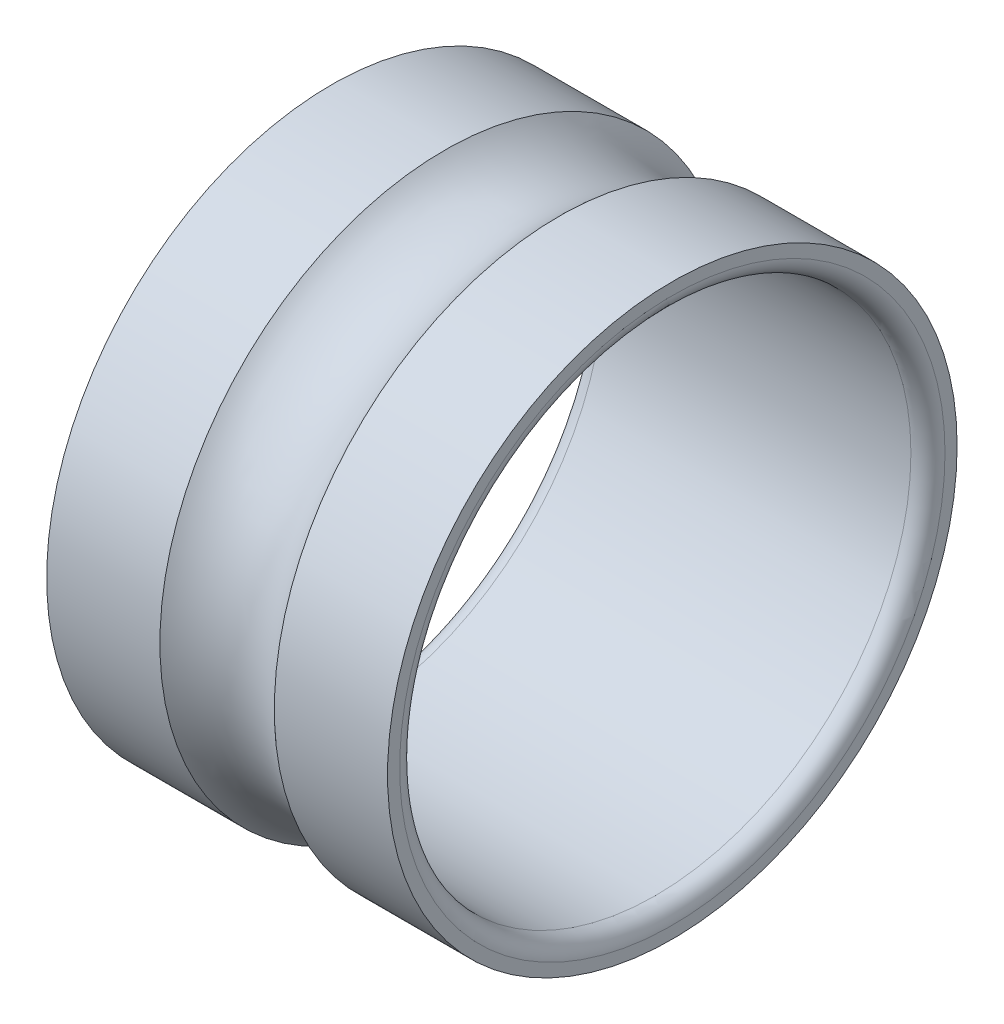
ISO-10303-21;
HEADER;
FILE_DESCRIPTION(('STEP AP214'),'2;1');
FILE_NAME('part.step','',(''),(''),'','','');
FILE_SCHEMA(('AUTOMOTIVE_DESIGN { 1 0 10303 214 1 1 1 1 }'));
ENDSEC;
DATA;
#1=APPLICATION_CONTEXT('core data for automotive mechanical design processes');
#2=APPLICATION_PROTOCOL_DEFINITION('international standard','automotive_design',2000,#1);
#3=PRODUCT_CONTEXT('',#1,'mechanical');
#4=PRODUCT('Part','Part','',(#3));
#5=PRODUCT_RELATED_PRODUCT_CATEGORY('part','',(#4));
#6=PRODUCT_DEFINITION_FORMATION('','',#4);
#7=PRODUCT_DEFINITION_CONTEXT('part definition',#1,'design');
#8=PRODUCT_DEFINITION('design','',#6,#7);
#9=PRODUCT_DEFINITION_SHAPE('','',#8);
#10=(LENGTH_UNIT() NAMED_UNIT(*) SI_UNIT(.MILLI.,.METRE.));
#11=(NAMED_UNIT(*) PLANE_ANGLE_UNIT() SI_UNIT($,.RADIAN.));
#12=(NAMED_UNIT(*) SI_UNIT($,.STERADIAN.) SOLID_ANGLE_UNIT());
#13=UNCERTAINTY_MEASURE_WITH_UNIT(LENGTH_MEASURE(1.E-05),#10,'distance_accuracy_value','');
#14=(GEOMETRIC_REPRESENTATION_CONTEXT(3) GLOBAL_UNCERTAINTY_ASSIGNED_CONTEXT((#13)) GLOBAL_UNIT_ASSIGNED_CONTEXT((#10,
#11,#12)) REPRESENTATION_CONTEXT('',''));
#15=CARTESIAN_POINT('',(0.,0.,0.));
#16=DIRECTION('',(0.,0.,1.));
#17=DIRECTION('',(1.,0.,0.));
#18=AXIS2_PLACEMENT_3D('',#15,#16,#17);
#19=CARTESIAN_POINT('',(-1.42875,0.,0.));
#20=DIRECTION('',(1.,0.,0.));
#21=DIRECTION('',(0.,0.,-1.));
#22=AXIS2_PLACEMENT_3D('',#19,#20,#21);
#23=TOROIDAL_SURFACE('',#22,2.54,0.15875);
#24=CARTESIAN_POINT('',(-1.42875,0.,0.));
#25=DIRECTION('',(1.,0.,0.));
#26=DIRECTION('',(0.,0.,-1.));
#27=AXIS2_PLACEMENT_3D('',#24,#25,#26);
#28=CIRCLE('',#27,2.38125);
#29=CARTESIAN_POINT('',(-1.42875,0.,-2.38125));
#30=VERTEX_POINT('',#29);
#31=EDGE_CURVE('E10',#30,#30,#28,.T.);
#32=ORIENTED_EDGE('',*,*,#31,.T.);
#33=EDGE_LOOP('',(#32));
#34=FACE_BOUND('',#33,.T.);
#35=CARTESIAN_POINT('',(-1.5875,0.,0.));
#36=DIRECTION('',(1.,0.,0.));
#37=DIRECTION('',(0.,0.,-1.));
#38=AXIS2_PLACEMENT_3D('',#35,#36,#37);
#39=CIRCLE('',#38,2.54);
#40=CARTESIAN_POINT('',(-1.5875,0.,-2.54));
#41=VERTEX_POINT('',#40);
#42=EDGE_CURVE('E58',#41,#41,#39,.T.);
#43=ORIENTED_EDGE('',*,*,#42,.F.);
#44=EDGE_LOOP('',(#43));
#45=FACE_BOUND('',#44,.T.);
#46=ADVANCED_FACE('F30',(#34,#45),#23,.T.);
#47=CARTESIAN_POINT('',(-1.5875,0.,0.));
#48=DIRECTION('',(1.,0.,0.));
#49=DIRECTION('',(0.,0.,-1.));
#50=AXIS2_PLACEMENT_3D('',#47,#48,#49);
#51=CYLINDRICAL_SURFACE('',#50,2.38125);
#52=CARTESIAN_POINT('',(1.42875,0.,0.));
#53=DIRECTION('',(1.,0.,0.));
#54=DIRECTION('',(0.,0.,-1.));
#55=AXIS2_PLACEMENT_3D('',#52,#53,#54);
#56=CIRCLE('',#55,2.38125);
#57=CARTESIAN_POINT('',(1.42875,0.,-2.38125));
#58=VERTEX_POINT('',#57);
#59=EDGE_CURVE('E36',#58,#58,#56,.T.);
#60=ORIENTED_EDGE('',*,*,#59,.T.);
#61=EDGE_LOOP('',(#60));
#62=FACE_BOUND('',#61,.T.);
#63=ORIENTED_EDGE('',*,*,#31,.F.);
#64=EDGE_LOOP('',(#63));
#65=FACE_BOUND('',#64,.T.);
#66=ADVANCED_FACE('F66',(#62,#65),#51,.F.);
#67=CARTESIAN_POINT('',(1.42875,0.,0.));
#68=DIRECTION('',(1.,0.,0.));
#69=DIRECTION('',(0.,0.,-1.));
#70=AXIS2_PLACEMENT_3D('',#67,#68,#69);
#71=TOROIDAL_SURFACE('',#70,2.54,0.15875);
#72=CARTESIAN_POINT('',(1.5875,0.,0.));
#73=DIRECTION('',(1.,0.,0.));
#74=DIRECTION('',(0.,0.,-1.));
#75=AXIS2_PLACEMENT_3D('',#72,#73,#74);
#76=CIRCLE('',#75,2.54);
#77=CARTESIAN_POINT('',(1.5875,0.,-2.54));
#78=VERTEX_POINT('',#77);
#79=EDGE_CURVE('E40',#78,#78,#76,.T.);
#80=ORIENTED_EDGE('',*,*,#79,.T.);
#81=EDGE_LOOP('',(#80));
#82=FACE_BOUND('',#81,.T.);
#83=ORIENTED_EDGE('',*,*,#59,.F.);
#84=EDGE_LOOP('',(#83));
#85=FACE_BOUND('',#84,.T.);
#86=ADVANCED_FACE('F70',(#82,#85),#71,.T.);
#87=CARTESIAN_POINT('',(1.5875,2.54,0.));
#88=DIRECTION('',(1.,0.,0.));
#89=DIRECTION('',(0.,0.,-1.));
#90=AXIS2_PLACEMENT_3D('',#87,#88,#89);
#91=PLANE('',#90);
#92=CARTESIAN_POINT('',(1.5875,0.,0.));
#93=DIRECTION('',(1.,0.,0.));
#94=DIRECTION('',(0.,0.,-1.));
#95=AXIS2_PLACEMENT_3D('',#92,#93,#94);
#96=CIRCLE('',#95,2.6527125);
#97=CARTESIAN_POINT('',(1.5875,0.,-2.6527125));
#98=VERTEX_POINT('',#97);
#99=EDGE_CURVE('E44',#98,#98,#96,.T.);
#100=ORIENTED_EDGE('',*,*,#99,.T.);
#101=EDGE_LOOP('',(#100));
#102=FACE_BOUND('',#101,.T.);
#103=ORIENTED_EDGE('',*,*,#79,.F.);
#104=EDGE_LOOP('',(#103));
#105=FACE_BOUND('',#104,.T.);
#106=ADVANCED_FACE('F74',(#102,#105),#91,.T.);
#107=CARTESIAN_POINT('',(-1.5875,0.,0.));
#108=DIRECTION('',(1.,0.,0.));
#109=DIRECTION('',(0.,0.,-1.));
#110=AXIS2_PLACEMENT_3D('',#107,#108,#109);
#111=CYLINDRICAL_SURFACE('',#110,2.6527125);
#112=CARTESIAN_POINT('',(0.532839828624654,0.,0.));
#113=DIRECTION('',(1.,0.,0.));
#114=DIRECTION('',(0.,0.,-1.));
#115=AXIS2_PLACEMENT_3D('',#112,#113,#114);
#116=CIRCLE('',#115,2.6527125);
#117=CARTESIAN_POINT('',(0.532839828624654,0.,-2.6527125));
#118=VERTEX_POINT('',#117);
#119=EDGE_CURVE('E49',#118,#118,#116,.T.);
#120=ORIENTED_EDGE('',*,*,#119,.T.);
#121=EDGE_LOOP('',(#120));
#122=FACE_BOUND('',#121,.T.);
#123=ORIENTED_EDGE('',*,*,#99,.F.);
#124=EDGE_LOOP('',(#123));
#125=FACE_BOUND('',#124,.T.);
#126=ADVANCED_FACE('F81',(#122,#125),#111,.T.);
#127=CARTESIAN_POINT('',(0.,0.,0.));
#128=DIRECTION('',(1.,0.,0.));
#129=DIRECTION('',(0.,0.,-1.));
#130=AXIS2_PLACEMENT_3D('',#127,#128,#129);
#131=TOROIDAL_SURFACE('',#130,3.175,0.746125);
#132=CARTESIAN_POINT('',(-0.532839828624653,0.,0.));
#133=DIRECTION('',(1.,0.,0.));
#134=DIRECTION('',(0.,0.,-1.));
#135=AXIS2_PLACEMENT_3D('',#132,#133,#134);
#136=CIRCLE('',#135,2.6527125);
#137=CARTESIAN_POINT('',(-0.532839828624653,0.,-2.6527125));
#138=VERTEX_POINT('',#137);
#139=EDGE_CURVE('E52',#138,#138,#136,.T.);
#140=ORIENTED_EDGE('',*,*,#139,.T.);
#141=EDGE_LOOP('',(#140));
#142=FACE_BOUND('',#141,.T.);
#143=ORIENTED_EDGE('',*,*,#119,.F.);
#144=EDGE_LOOP('',(#143));
#145=FACE_BOUND('',#144,.T.);
#146=ADVANCED_FACE('F85',(#142,#145),#131,.F.);
#147=CARTESIAN_POINT('',(-1.5875,0.,0.));
#148=DIRECTION('',(1.,0.,0.));
#149=DIRECTION('',(0.,0.,-1.));
#150=AXIS2_PLACEMENT_3D('',#147,#148,#149);
#151=CYLINDRICAL_SURFACE('',#150,2.6527125);
#152=CARTESIAN_POINT('',(-1.5875,0.,0.));
#153=DIRECTION('',(1.,0.,0.));
#154=DIRECTION('',(0.,0.,-1.));
#155=AXIS2_PLACEMENT_3D('',#152,#153,#154);
#156=CIRCLE('',#155,2.6527125);
#157=CARTESIAN_POINT('',(-1.5875,0.,-2.6527125));
#158=VERTEX_POINT('',#157);
#159=EDGE_CURVE('E55',#158,#158,#156,.T.);
#160=ORIENTED_EDGE('',*,*,#159,.T.);
#161=EDGE_LOOP('',(#160));
#162=FACE_BOUND('',#161,.T.);
#163=ORIENTED_EDGE('',*,*,#139,.F.);
#164=EDGE_LOOP('',(#163));
#165=FACE_BOUND('',#164,.T.);
#166=ADVANCED_FACE('F89',(#162,#165),#151,.T.);
#167=CARTESIAN_POINT('',(-1.5875,2.6527125,0.));
#168=DIRECTION('',(-1.,0.,0.));
#169=DIRECTION('',(0.,0.,1.));
#170=AXIS2_PLACEMENT_3D('',#167,#168,#169);
#171=PLANE('',#170);
#172=ORIENTED_EDGE('',*,*,#42,.T.);
#173=EDGE_LOOP('',(#172));
#174=FACE_BOUND('',#173,.T.);
#175=ORIENTED_EDGE('',*,*,#159,.F.);
#176=EDGE_LOOP('',(#175));
#177=FACE_BOUND('',#176,.T.);
#178=ADVANCED_FACE('F62',(#174,#177),#171,.T.);
#179=CLOSED_SHELL('',(#46,#66,#86,#106,#126,#146,#166,#178));
#180=MANIFOLD_SOLID_BREP('B2',#179);
#181=ADVANCED_BREP_SHAPE_REPRESENTATION('',(#18,#180),#14);
#182=SHAPE_DEFINITION_REPRESENTATION(#9,#181);
ENDSEC;
END-ISO-10303-21;
